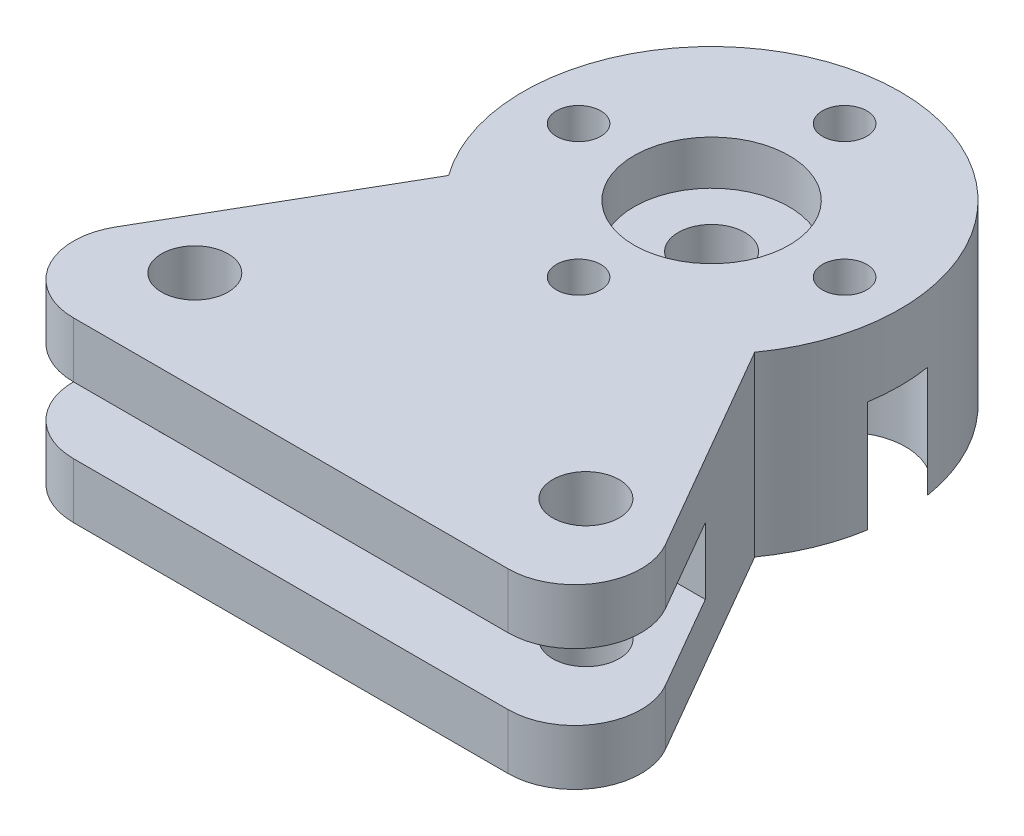
ISO-10303-21;
HEADER;
FILE_DESCRIPTION(('STEP AP214'),'2;1');
FILE_NAME('part.step','',(''),(''),'','','');
FILE_SCHEMA(('AUTOMOTIVE_DESIGN { 1 0 10303 214 1 1 1 1 }'));
ENDSEC;
DATA;
#1=APPLICATION_CONTEXT('core data for automotive mechanical design processes');
#2=APPLICATION_PROTOCOL_DEFINITION('international standard','automotive_design',2000,#1);
#3=PRODUCT_CONTEXT('',#1,'mechanical');
#4=PRODUCT('Part','Part','',(#3));
#5=PRODUCT_RELATED_PRODUCT_CATEGORY('part','',(#4));
#6=PRODUCT_DEFINITION_FORMATION('','',#4);
#7=PRODUCT_DEFINITION_CONTEXT('part definition',#1,'design');
#8=PRODUCT_DEFINITION('design','',#6,#7);
#9=PRODUCT_DEFINITION_SHAPE('','',#8);
#10=(LENGTH_UNIT() NAMED_UNIT(*) SI_UNIT(.MILLI.,.METRE.));
#11=(NAMED_UNIT(*) PLANE_ANGLE_UNIT() SI_UNIT($,.RADIAN.));
#12=(NAMED_UNIT(*) SI_UNIT($,.STERADIAN.) SOLID_ANGLE_UNIT());
#13=UNCERTAINTY_MEASURE_WITH_UNIT(LENGTH_MEASURE(1.E-05),#10,'distance_accuracy_value','');
#14=(GEOMETRIC_REPRESENTATION_CONTEXT(3) GLOBAL_UNCERTAINTY_ASSIGNED_CONTEXT((#13)) GLOBAL_UNIT_ASSIGNED_CONTEXT((#10,
#11,#12)) REPRESENTATION_CONTEXT('',''));
#15=CARTESIAN_POINT('',(0.,0.,0.));
#16=DIRECTION('',(0.,0.,1.));
#17=DIRECTION('',(1.,0.,0.));
#18=AXIS2_PLACEMENT_3D('',#15,#16,#17);
#19=CARTESIAN_POINT('',(0.,8.,-10.3205080756888));
#20=DIRECTION('',(0.,-1.,0.));
#21=DIRECTION('',(0.,0.,-1.));
#22=AXIS2_PLACEMENT_3D('',#19,#20,#21);
#23=CYLINDRICAL_SURFACE('',#22,1.49999999999987);
#24=CARTESIAN_POINT('',(0.,0.,-10.3205080756888));
#25=DIRECTION('',(0.,1.,0.));
#26=DIRECTION('',(0.,0.,1.));
#27=AXIS2_PLACEMENT_3D('',#24,#25,#26);
#28=CIRCLE('',#27,1.49999999999987);
#29=CARTESIAN_POINT('',(0.,0.,-8.82050807568898));
#30=VERTEX_POINT('',#29);
#31=EDGE_CURVE('E297',#30,#30,#28,.T.);
#32=ORIENTED_EDGE('',*,*,#31,.F.);
#33=EDGE_LOOP('',(#32));
#34=FACE_BOUND('',#33,.T.);
#35=CARTESIAN_POINT('',(0.,6.,-10.3205080756888));
#36=DIRECTION('',(0.,1.,0.));
#37=DIRECTION('',(0.,0.,1.));
#38=AXIS2_PLACEMENT_3D('',#35,#36,#37);
#39=CIRCLE('',#38,1.49999999999987);
#40=CARTESIAN_POINT('',(0.,6.,-8.82050807568898));
#41=VERTEX_POINT('',#40);
#42=EDGE_CURVE('E368',#41,#41,#39,.T.);
#43=ORIENTED_EDGE('',*,*,#42,.T.);
#44=EDGE_LOOP('',(#43));
#45=FACE_BOUND('',#44,.T.);
#46=ADVANCED_FACE('F67',(#34,#45),#23,.F.);
#47=CARTESIAN_POINT('',(5.99999999999984,32.0416305603426,-10.3205080756888));
#48=DIRECTION('',(0.,-1.,0.));
#49=DIRECTION('',(0.,0.,-1.));
#50=AXIS2_PLACEMENT_3D('',#47,#48,#49);
#51=CYLINDRICAL_SURFACE('',#50,1.);
#52=CARTESIAN_POINT('',(5.99999999999984,8.,-10.3205080756888));
#53=DIRECTION('',(0.,1.,0.));
#54=DIRECTION('',(0.,0.,1.));
#55=AXIS2_PLACEMENT_3D('',#52,#53,#54);
#56=CIRCLE('',#55,1.);
#57=CARTESIAN_POINT('',(5.99999999999984,8.,-9.32050807568884));
#58=VERTEX_POINT('',#57);
#59=EDGE_CURVE('E242',#58,#58,#56,.F.);
#60=ORIENTED_EDGE('',*,*,#59,.F.);
#61=EDGE_LOOP('',(#60));
#62=FACE_BOUND('',#61,.T.);
#63=CARTESIAN_POINT('',(5.99999999999984,5.,-10.3205080756888));
#64=DIRECTION('',(0.,-1.,0.));
#65=DIRECTION('',(0.,0.,-1.));
#66=AXIS2_PLACEMENT_3D('',#63,#64,#65);
#67=CIRCLE('',#66,1.);
#68=CARTESIAN_POINT('',(5.99999999999984,5.,-11.3205080756888));
#69=VERTEX_POINT('',#68);
#70=EDGE_CURVE('E236',#69,#69,#67,.F.);
#71=ORIENTED_EDGE('',*,*,#70,.F.);
#72=EDGE_LOOP('',(#71));
#73=FACE_BOUND('',#72,.T.);
#74=ADVANCED_FACE('F469',(#62,#73),#51,.F.);
#75=CARTESIAN_POINT('',(-1.59594559789866E-13,32.0416305603426,-16.3205080756888));
#76=DIRECTION('',(0.,-1.,0.));
#77=DIRECTION('',(0.,0.,-1.));
#78=AXIS2_PLACEMENT_3D('',#75,#76,#77);
#79=CYLINDRICAL_SURFACE('',#78,1.);
#80=CARTESIAN_POINT('',(-1.59594559789866E-13,8.,-16.3205080756888));
#81=DIRECTION('',(0.,1.,0.));
#82=DIRECTION('',(0.,0.,1.));
#83=AXIS2_PLACEMENT_3D('',#80,#81,#82);
#84=CIRCLE('',#83,1.);
#85=CARTESIAN_POINT('',(-1.59594559789866E-13,8.,-15.3205080756888));
#86=VERTEX_POINT('',#85);
#87=EDGE_CURVE('E216',#86,#86,#84,.F.);
#88=ORIENTED_EDGE('',*,*,#87,.F.);
#89=EDGE_LOOP('',(#88));
#90=FACE_BOUND('',#89,.T.);
#91=CARTESIAN_POINT('',(-1.59594559789866E-13,5.,-16.3205080756888));
#92=DIRECTION('',(0.,-1.,0.));
#93=DIRECTION('',(0.,0.,-1.));
#94=AXIS2_PLACEMENT_3D('',#91,#92,#93);
#95=CIRCLE('',#94,1.);
#96=CARTESIAN_POINT('',(-1.59594559789866E-13,5.,-17.3205080756888));
#97=VERTEX_POINT('',#96);
#98=EDGE_CURVE('E356',#97,#97,#95,.F.);
#99=ORIENTED_EDGE('',*,*,#98,.F.);
#100=EDGE_LOOP('',(#99));
#101=FACE_BOUND('',#100,.T.);
#102=ADVANCED_FACE('F475',(#90,#101),#79,.F.);
#103=CARTESIAN_POINT('',(-6.00000000000016,32.0416305603426,-10.3205080756888));
#104=DIRECTION('',(0.,-1.,0.));
#105=DIRECTION('',(0.,0.,-1.));
#106=AXIS2_PLACEMENT_3D('',#103,#104,#105);
#107=CYLINDRICAL_SURFACE('',#106,1.);
#108=CARTESIAN_POINT('',(-6.00000000000016,8.,-10.3205080756888));
#109=DIRECTION('',(0.,1.,0.));
#110=DIRECTION('',(0.,0.,1.));
#111=AXIS2_PLACEMENT_3D('',#108,#109,#110);
#112=CIRCLE('',#111,1.);
#113=CARTESIAN_POINT('',(-6.00000000000016,8.,-9.32050807568884));
#114=VERTEX_POINT('',#113);
#115=EDGE_CURVE('E221',#114,#114,#112,.F.);
#116=ORIENTED_EDGE('',*,*,#115,.F.);
#117=EDGE_LOOP('',(#116));
#118=FACE_BOUND('',#117,.T.);
#119=CARTESIAN_POINT('',(-6.00000000000016,5.,-10.3205080756888));
#120=DIRECTION('',(0.,-1.,0.));
#121=DIRECTION('',(0.,0.,-1.));
#122=AXIS2_PLACEMENT_3D('',#119,#120,#121);
#123=CIRCLE('',#122,1.);
#124=CARTESIAN_POINT('',(-6.00000000000016,5.,-11.3205080756888));
#125=VERTEX_POINT('',#124);
#126=EDGE_CURVE('E353',#125,#125,#123,.F.);
#127=ORIENTED_EDGE('',*,*,#126,.F.);
#128=EDGE_LOOP('',(#127));
#129=FACE_BOUND('',#128,.T.);
#130=ADVANCED_FACE('F502',(#118,#129),#107,.F.);
#131=CARTESIAN_POINT('',(9.80384757729342,8.,5.66025403784427));
#132=DIRECTION('',(0.,-1.,0.));
#133=DIRECTION('',(0.,0.,-1.));
#134=AXIS2_PLACEMENT_3D('',#131,#132,#133);
#135=CYLINDRICAL_SURFACE('',#134,3.);
#136=DIRECTION('',(0.,-1.,0.));
#137=VECTOR('',#136,1.);
#138=CARTESIAN_POINT('',(9.80384757729323,8.,8.66025403784454));
#139=LINE('',#138,#137);
#140=CARTESIAN_POINT('',(9.80384757729323,8.,8.66025403784454));
#141=VERTEX_POINT('',#140);
#142=CARTESIAN_POINT('',(9.80384757729323,5.5,8.66025403784439));
#143=VERTEX_POINT('',#142);
#144=EDGE_CURVE('E328',#141,#143,#139,.T.);
#145=ORIENTED_EDGE('',*,*,#144,.T.);
#146=CARTESIAN_POINT('',(9.80384757729342,5.5,5.66025403784427));
#147=DIRECTION('',(0.,1.,0.));
#148=DIRECTION('',(0.,0.,1.));
#149=AXIS2_PLACEMENT_3D('',#146,#147,#148);
#150=CIRCLE('',#149,3.);
#151=CARTESIAN_POINT('',(12.4019237886466,5.5,4.16025403784458));
#152=VERTEX_POINT('',#151);
#153=EDGE_CURVE('E281',#143,#152,#150,.T.);
#154=ORIENTED_EDGE('',*,*,#153,.T.);
#155=DIRECTION('',(0.,-1.,0.));
#156=VECTOR('',#155,1.);
#157=CARTESIAN_POINT('',(12.4019237886466,8.,4.16025403784458));
#158=LINE('',#157,#156);
#159=CARTESIAN_POINT('',(12.4019237886466,8.,4.16025403784458));
#160=VERTEX_POINT('',#159);
#161=EDGE_CURVE('E340',#160,#152,#158,.T.);
#162=ORIENTED_EDGE('',*,*,#161,.F.);
#163=CARTESIAN_POINT('',(9.80384757729342,8.,5.66025403784427));
#164=DIRECTION('',(0.,1.,0.));
#165=DIRECTION('',(0.,0.,1.));
#166=AXIS2_PLACEMENT_3D('',#163,#164,#165);
#167=CIRCLE('',#166,3.);
#168=EDGE_CURVE('E303',#141,#160,#167,.T.);
#169=ORIENTED_EDGE('',*,*,#168,.F.);
#170=EDGE_LOOP('',(#145,#154,#162,#169));
#171=FACE_BOUND('',#170,.T.);
#172=ADVANCED_FACE('F439',(#171),#135,.T.);
#173=CARTESIAN_POINT('',(-9.8038475772933,8.,5.66025403784441));
#174=DIRECTION('',(0.,-1.,0.));
#175=DIRECTION('',(0.,0.,-1.));
#176=AXIS2_PLACEMENT_3D('',#173,#174,#175);
#177=CYLINDRICAL_SURFACE('',#176,3.00000000000003);
#178=DIRECTION('',(0.,-1.,0.));
#179=VECTOR('',#178,1.);
#180=CARTESIAN_POINT('',(-12.4019237886466,8.,4.16025403784429));
#181=LINE('',#180,#179);
#182=CARTESIAN_POINT('',(-12.4019237886466,8.,4.16025403784429));
#183=VERTEX_POINT('',#182);
#184=CARTESIAN_POINT('',(-12.4019237886466,5.5,4.16025403784429));
#185=VERTEX_POINT('',#184);
#186=EDGE_CURVE('E336',#183,#185,#181,.T.);
#187=ORIENTED_EDGE('',*,*,#186,.T.);
#188=CARTESIAN_POINT('',(-9.8038475772933,5.5,5.66025403784441));
#189=DIRECTION('',(0.,1.,0.));
#190=DIRECTION('',(0.,0.,1.));
#191=AXIS2_PLACEMENT_3D('',#188,#189,#190);
#192=CIRCLE('',#191,3.00000000000003);
#193=CARTESIAN_POINT('',(-9.80384757729351,5.5,8.66025403784439));
#194=VERTEX_POINT('',#193);
#195=EDGE_CURVE('E272',#185,#194,#192,.T.);
#196=ORIENTED_EDGE('',*,*,#195,.T.);
#197=DIRECTION('',(0.,-1.,0.));
#198=VECTOR('',#197,1.);
#199=CARTESIAN_POINT('',(-9.80384757729351,8.,8.66025403784424));
#200=LINE('',#199,#198);
#201=CARTESIAN_POINT('',(-9.80384757729351,8.,8.66025403784424));
#202=VERTEX_POINT('',#201);
#203=EDGE_CURVE('E332',#202,#194,#200,.T.);
#204=ORIENTED_EDGE('',*,*,#203,.F.);
#205=CARTESIAN_POINT('',(-9.8038475772933,8.,5.66025403784441));
#206=DIRECTION('',(0.,1.,0.));
#207=DIRECTION('',(0.,0.,1.));
#208=AXIS2_PLACEMENT_3D('',#205,#206,#207);
#209=CIRCLE('',#208,3.00000000000003);
#210=EDGE_CURVE('E312',#183,#202,#209,.T.);
#211=ORIENTED_EDGE('',*,*,#210,.F.);
#212=EDGE_LOOP('',(#187,#196,#204,#211));
#213=FACE_BOUND('',#212,.T.);
#214=ADVANCED_FACE('F449',(#213),#177,.T.);
#215=CARTESIAN_POINT('',(-9.80384757729351,8.,8.66025403784424));
#216=DIRECTION('',(0.,0.,-1.));
#217=DIRECTION('',(-1.,0.,0.));
#218=AXIS2_PLACEMENT_3D('',#215,#216,#217);
#219=PLANE('',#218);
#220=ORIENTED_EDGE('',*,*,#203,.T.);
#221=DIRECTION('',(-1.,0.,0.));
#222=VECTOR('',#221,1.);
#223=CARTESIAN_POINT('',(-13.188871290062,5.5,8.66025403784439));
#224=LINE('',#223,#222);
#225=EDGE_CURVE('E241',#143,#194,#224,.T.);
#226=ORIENTED_EDGE('',*,*,#225,.F.);
#227=ORIENTED_EDGE('',*,*,#144,.F.);
#228=DIRECTION('',(1.,0.,0.));
#229=VECTOR('',#228,1.);
#230=CARTESIAN_POINT('',(-9.80384757729351,8.,8.66025403784424));
#231=LINE('',#230,#229);
#232=EDGE_CURVE('E314',#202,#141,#231,.T.);
#233=ORIENTED_EDGE('',*,*,#232,.F.);
#234=EDGE_LOOP('',(#220,#226,#227,#233));
#235=FACE_BOUND('',#234,.T.);
#236=ADVANCED_FACE('F446',(#235),#219,.F.);
#237=CARTESIAN_POINT('',(-8.82025404,8.,4.16949192431116));
#238=DIRECTION('',(0.,-1.,0.));
#239=DIRECTION('',(0.,0.,-1.));
#240=AXIS2_PLACEMENT_3D('',#237,#238,#239);
#241=CYLINDRICAL_SURFACE('',#240,1.5);
#242=CARTESIAN_POINT('',(-8.82025404,5.5,4.16949192431116));
#243=DIRECTION('',(0.,1.,0.));
#244=DIRECTION('',(0.,0.,1.));
#245=AXIS2_PLACEMENT_3D('',#242,#243,#244);
#246=CIRCLE('',#245,1.5);
#247=CARTESIAN_POINT('',(-8.82025404,5.5,5.66949192431116));
#248=VERTEX_POINT('',#247);
#249=EDGE_CURVE('E269',#248,#248,#246,.T.);
#250=ORIENTED_EDGE('',*,*,#249,.F.);
#251=EDGE_LOOP('',(#250));
#252=FACE_BOUND('',#251,.T.);
#253=CARTESIAN_POINT('',(-8.82025404,8.,4.16949192431116));
#254=DIRECTION('',(0.,1.,0.));
#255=DIRECTION('',(0.,0.,1.));
#256=AXIS2_PLACEMENT_3D('',#253,#254,#255);
#257=CIRCLE('',#256,1.5);
#258=CARTESIAN_POINT('',(-8.82025404,8.,5.66949192431116));
#259=VERTEX_POINT('',#258);
#260=EDGE_CURVE('E294',#259,#259,#257,.T.);
#261=ORIENTED_EDGE('',*,*,#260,.T.);
#262=EDGE_LOOP('',(#261));
#263=FACE_BOUND('',#262,.T.);
#264=ADVANCED_FACE('F526',(#252,#263),#241,.F.);
#265=CARTESIAN_POINT('',(8.82025404,8.,4.16949192431116));
#266=DIRECTION('',(0.,-1.,0.));
#267=DIRECTION('',(0.,0.,-1.));
#268=AXIS2_PLACEMENT_3D('',#265,#266,#267);
#269=CYLINDRICAL_SURFACE('',#268,1.5);
#270=CARTESIAN_POINT('',(8.82025404,5.5,4.16949192431116));
#271=DIRECTION('',(0.,1.,0.));
#272=DIRECTION('',(0.,0.,1.));
#273=AXIS2_PLACEMENT_3D('',#270,#271,#272);
#274=CIRCLE('',#273,1.5);
#275=CARTESIAN_POINT('',(8.82025404,5.5,5.66949192431116));
#276=VERTEX_POINT('',#275);
#277=EDGE_CURVE('E268',#276,#276,#274,.T.);
#278=ORIENTED_EDGE('',*,*,#277,.F.);
#279=EDGE_LOOP('',(#278));
#280=FACE_BOUND('',#279,.T.);
#281=CARTESIAN_POINT('',(8.82025404,8.,4.16949192431116));
#282=DIRECTION('',(0.,1.,0.));
#283=DIRECTION('',(0.,0.,-1.));
#284=AXIS2_PLACEMENT_3D('',#281,#282,#283);
#285=CIRCLE('',#284,1.5);
#286=CARTESIAN_POINT('',(8.82025404,8.,2.66949192431116));
#287=VERTEX_POINT('',#286);
#288=EDGE_CURVE('E288',#287,#287,#285,.T.);
#289=ORIENTED_EDGE('',*,*,#288,.T.);
#290=EDGE_LOOP('',(#289));
#291=FACE_BOUND('',#290,.T.);
#292=ADVANCED_FACE('F485',(#280,#291),#269,.F.);
#293=CARTESIAN_POINT('',(9.80384757729342,8.,5.66025403784427));
#294=DIRECTION('',(0.,1.,0.));
#295=DIRECTION('',(0.,0.,1.));
#296=AXIS2_PLACEMENT_3D('',#293,#294,#295);
#297=PLANE('',#296);
#298=CARTESIAN_POINT('',(0.,8.,-4.32050807568884));
#299=DIRECTION('',(0.,1.,0.));
#300=DIRECTION('',(0.,0.,1.));
#301=AXIS2_PLACEMENT_3D('',#298,#299,#300);
#302=CIRCLE('',#301,1.);
#303=CARTESIAN_POINT('',(0.,8.,-3.32050807568884));
#304=VERTEX_POINT('',#303);
#305=EDGE_CURVE('E383',#304,#304,#302,.T.);
#306=ORIENTED_EDGE('',*,*,#305,.F.);
#307=EDGE_LOOP('',(#306));
#308=FACE_BOUND('',#307,.T.);
#309=CARTESIAN_POINT('',(0.,8.,-10.3205080756888));
#310=DIRECTION('',(0.,1.,0.));
#311=DIRECTION('',(0.,0.,1.));
#312=AXIS2_PLACEMENT_3D('',#309,#310,#311);
#313=CIRCLE('',#312,3.5);
#314=CARTESIAN_POINT('',(0.,8.,-6.82050807568885));
#315=VERTEX_POINT('',#314);
#316=EDGE_CURVE('E378',#315,#315,#313,.T.);
#317=ORIENTED_EDGE('',*,*,#316,.F.);
#318=EDGE_LOOP('',(#317));
#319=FACE_BOUND('',#318,.T.);
#320=DIRECTION('',(-0.499999999999987,0.,-0.866025403784447));
#321=VECTOR('',#320,1.);
#322=CARTESIAN_POINT('',(12.4019237886466,8.,4.16025403784458));
#323=LINE('',#322,#321);
#324=CARTESIAN_POINT('',(6.90407225945287,8.,-5.36230414318958));
#325=VERTEX_POINT('',#324);
#326=EDGE_CURVE('E306',#160,#325,#323,.T.);
#327=ORIENTED_EDGE('',*,*,#326,.T.);
#328=CARTESIAN_POINT('',(-1.59594559789866E-13,8.,-10.3205080756888));
#329=DIRECTION('',(0.,1.,0.));
#330=DIRECTION('',(0.,0.,1.));
#331=AXIS2_PLACEMENT_3D('',#328,#329,#330);
#332=CIRCLE('',#331,8.5);
#333=CARTESIAN_POINT('',(-6.90407225945299,8.,-5.3623041431893));
#334=VERTEX_POINT('',#333);
#335=EDGE_CURVE('E226',#334,#325,#332,.F.);
#336=ORIENTED_EDGE('',*,*,#335,.F.);
#337=DIRECTION('',(-0.500000000000014,0.,0.866025403784431));
#338=VECTOR('',#337,1.);
#339=CARTESIAN_POINT('',(-2.59807621135311,8.,-12.8205080756888));
#340=LINE('',#339,#338);
#341=EDGE_CURVE('E310',#334,#183,#340,.T.);
#342=ORIENTED_EDGE('',*,*,#341,.T.);
#343=ORIENTED_EDGE('',*,*,#210,.T.);
#344=ORIENTED_EDGE('',*,*,#232,.T.);
#345=ORIENTED_EDGE('',*,*,#168,.T.);
#346=EDGE_LOOP('',(#327,#336,#342,#343,#344,#345));
#347=FACE_BOUND('',#346,.T.);
#348=ORIENTED_EDGE('',*,*,#260,.F.);
#349=EDGE_LOOP('',(#348));
#350=FACE_BOUND('',#349,.T.);
#351=ORIENTED_EDGE('',*,*,#288,.F.);
#352=EDGE_LOOP('',(#351));
#353=FACE_BOUND('',#352,.T.);
#354=ORIENTED_EDGE('',*,*,#59,.T.);
#355=EDGE_LOOP('',(#354));
#356=FACE_BOUND('',#355,.T.);
#357=ORIENTED_EDGE('',*,*,#115,.T.);
#358=EDGE_LOOP('',(#357));
#359=FACE_BOUND('',#358,.T.);
#360=ORIENTED_EDGE('',*,*,#87,.T.);
#361=EDGE_LOOP('',(#360));
#362=FACE_BOUND('',#361,.T.);
#363=ADVANCED_FACE('F433',(#308,#319,#347,#350,#353,#356,#359,#362),#297,.T.);
#364=CARTESIAN_POINT('',(9.80384757729342,0.,5.66025403784427));
#365=DIRECTION('',(0.,1.,0.));
#366=DIRECTION('',(0.,0.,1.));
#367=AXIS2_PLACEMENT_3D('',#364,#365,#366);
#368=PLANE('',#367);
#369=CARTESIAN_POINT('',(-1.63866938456849E-13,0.,-4.32050807568885));
#370=DIRECTION('',(0.,-1.,0.));
#371=DIRECTION('',(0.,0.,1.));
#372=AXIS2_PLACEMENT_3D('',#369,#370,#371);
#373=CIRCLE('',#372,2.75);
#374=CARTESIAN_POINT('',(-1.63866938456849E-13,0.,-1.57050807568885));
#375=VERTEX_POINT('',#374);
#376=EDGE_CURVE('E375',#375,#375,#373,.T.);
#377=ORIENTED_EDGE('',*,*,#376,.F.);
#378=EDGE_LOOP('',(#377));
#379=FACE_BOUND('',#378,.T.);
#380=CARTESIAN_POINT('',(-1.59594559789866E-13,0.,-10.3205080756888));
#381=DIRECTION('',(0.,-1.,0.));
#382=DIRECTION('',(0.,0.,-1.));
#383=AXIS2_PLACEMENT_3D('',#380,#381,#382);
#384=CIRCLE('',#383,8.5);
#385=CARTESIAN_POINT('',(-6.90407225945299,0.,-5.3623041431893));
#386=VERTEX_POINT('',#385);
#387=CARTESIAN_POINT('',(-8.39062500000016,0.,-8.96131268525559));
#388=VERTEX_POINT('',#387);
#389=EDGE_CURVE('E206',#386,#388,#384,.T.);
#390=ORIENTED_EDGE('',*,*,#389,.T.);
#391=CARTESIAN_POINT('',(-6.00000000000016,0.,-10.3205080756888));
#392=DIRECTION('',(0.,-1.,0.));
#393=DIRECTION('',(0.,0.,-1.));
#394=AXIS2_PLACEMENT_3D('',#391,#392,#393);
#395=CIRCLE('',#394,2.75);
#396=CARTESIAN_POINT('',(-8.39062500000016,0.,-11.6797034661221));
#397=VERTEX_POINT('',#396);
#398=EDGE_CURVE('E192',#397,#388,#395,.T.);
#399=ORIENTED_EDGE('',*,*,#398,.F.);
#400=CARTESIAN_POINT('',(-1.35919539043342,0.,-18.7111330756888));
#401=VERTEX_POINT('',#400);
#402=EDGE_CURVE('E217',#397,#401,#384,.T.);
#403=ORIENTED_EDGE('',*,*,#402,.T.);
#404=CARTESIAN_POINT('',(-1.59594559789866E-13,0.,-16.3205080756888));
#405=DIRECTION('',(0.,-1.,0.));
#406=DIRECTION('',(0.,0.,-1.));
#407=AXIS2_PLACEMENT_3D('',#404,#405,#406);
#408=CIRCLE('',#407,2.75);
#409=CARTESIAN_POINT('',(1.3591953904331,0.,-18.7111330756888));
#410=VERTEX_POINT('',#409);
#411=EDGE_CURVE('E390',#410,#401,#408,.T.);
#412=ORIENTED_EDGE('',*,*,#411,.F.);
#413=CARTESIAN_POINT('',(8.39062499999984,0.,-11.6797034661221));
#414=VERTEX_POINT('',#413);
#415=EDGE_CURVE('E223',#410,#414,#384,.T.);
#416=ORIENTED_EDGE('',*,*,#415,.T.);
#417=CARTESIAN_POINT('',(5.99999999999984,0.,-10.3205080756888));
#418=DIRECTION('',(0.,-1.,0.));
#419=DIRECTION('',(0.,0.,-1.));
#420=AXIS2_PLACEMENT_3D('',#417,#418,#419);
#421=CIRCLE('',#420,2.75);
#422=CARTESIAN_POINT('',(8.39062499999984,0.,-8.96131268525559));
#423=VERTEX_POINT('',#422);
#424=EDGE_CURVE('E201',#423,#414,#421,.T.);
#425=ORIENTED_EDGE('',*,*,#424,.F.);
#426=CARTESIAN_POINT('',(6.90407225945287,0.,-5.36230414318958));
#427=VERTEX_POINT('',#426);
#428=EDGE_CURVE('E219',#423,#427,#384,.T.);
#429=ORIENTED_EDGE('',*,*,#428,.T.);
#430=DIRECTION('',(-0.499999999999987,0.,-0.866025403784447));
#431=VECTOR('',#430,1.);
#432=CARTESIAN_POINT('',(12.4019237886466,0.,4.16025403784458));
#433=LINE('',#432,#431);
#434=CARTESIAN_POINT('',(12.4019237886466,0.,4.16025403784458));
#435=VERTEX_POINT('',#434);
#436=EDGE_CURVE('E319',#435,#427,#433,.T.);
#437=ORIENTED_EDGE('',*,*,#436,.F.);
#438=CARTESIAN_POINT('',(9.80384757729342,0.,5.66025403784427));
#439=DIRECTION('',(0.,1.,0.));
#440=DIRECTION('',(0.,0.,1.));
#441=AXIS2_PLACEMENT_3D('',#438,#439,#440);
#442=CIRCLE('',#441,3.);
#443=CARTESIAN_POINT('',(9.80384757729323,0.,8.66025403784454));
#444=VERTEX_POINT('',#443);
#445=EDGE_CURVE('E302',#444,#435,#442,.T.);
#446=ORIENTED_EDGE('',*,*,#445,.F.);
#447=DIRECTION('',(1.,0.,0.));
#448=VECTOR('',#447,1.);
#449=CARTESIAN_POINT('',(-9.80384757729351,0.,8.66025403784424));
#450=LINE('',#449,#448);
#451=CARTESIAN_POINT('',(-9.80384757729351,0.,8.66025403784424));
#452=VERTEX_POINT('',#451);
#453=EDGE_CURVE('E307',#452,#444,#450,.T.);
#454=ORIENTED_EDGE('',*,*,#453,.F.);
#455=CARTESIAN_POINT('',(-9.8038475772933,0.,5.66025403784441));
#456=DIRECTION('',(0.,1.,0.));
#457=DIRECTION('',(0.,0.,1.));
#458=AXIS2_PLACEMENT_3D('',#455,#456,#457);
#459=CIRCLE('',#458,3.00000000000003);
#460=CARTESIAN_POINT('',(-12.4019237886466,0.,4.16025403784429));
#461=VERTEX_POINT('',#460);
#462=EDGE_CURVE('E323',#461,#452,#459,.T.);
#463=ORIENTED_EDGE('',*,*,#462,.F.);
#464=DIRECTION('',(-0.500000000000014,0.,0.866025403784431));
#465=VECTOR('',#464,1.);
#466=CARTESIAN_POINT('',(-2.59807621135311,0.,-12.8205080756888));
#467=LINE('',#466,#465);
#468=EDGE_CURVE('E215',#386,#461,#467,.T.);
#469=ORIENTED_EDGE('',*,*,#468,.F.);
#470=EDGE_LOOP('',(#390,#399,#403,#412,#416,#425,#429,#437,#446,#454,#463,#469));
#471=FACE_BOUND('',#470,.T.);
#472=CARTESIAN_POINT('',(-8.82025404,0.,4.16949192431116));
#473=DIRECTION('',(0.,1.,0.));
#474=DIRECTION('',(0.,0.,1.));
#475=AXIS2_PLACEMENT_3D('',#472,#473,#474);
#476=CIRCLE('',#475,1.5);
#477=CARTESIAN_POINT('',(-8.82025404,0.,5.66949192431116));
#478=VERTEX_POINT('',#477);
#479=EDGE_CURVE('E291',#478,#478,#476,.T.);
#480=ORIENTED_EDGE('',*,*,#479,.T.);
#481=EDGE_LOOP('',(#480));
#482=FACE_BOUND('',#481,.T.);
#483=CARTESIAN_POINT('',(8.82025404,0.,4.16949192431116));
#484=DIRECTION('',(0.,1.,0.));
#485=DIRECTION('',(0.,0.,-1.));
#486=AXIS2_PLACEMENT_3D('',#483,#484,#485);
#487=CIRCLE('',#486,1.5);
#488=CARTESIAN_POINT('',(8.82025404,0.,2.66949192431116));
#489=VERTEX_POINT('',#488);
#490=EDGE_CURVE('E287',#489,#489,#487,.T.);
#491=ORIENTED_EDGE('',*,*,#490,.T.);
#492=EDGE_LOOP('',(#491));
#493=FACE_BOUND('',#492,.T.);
#494=ORIENTED_EDGE('',*,*,#31,.T.);
#495=EDGE_LOOP('',(#494));
#496=FACE_BOUND('',#495,.T.);
#497=ADVANCED_FACE('F212',(#379,#471,#482,#493,#496),#368,.F.);
#498=CARTESIAN_POINT('',(12.4019237886466,2.5,4.16025403784458));
#499=VERTEX_POINT('',#498);
#500=EDGE_CURVE('E339',#499,#435,#158,.T.);
#501=ORIENTED_EDGE('',*,*,#500,.F.);
#502=CARTESIAN_POINT('',(9.80384757729342,2.5,5.66025403784427));
#503=DIRECTION('',(0.,-1.,0.));
#504=DIRECTION('',(0.,0.,-1.));
#505=AXIS2_PLACEMENT_3D('',#502,#503,#504);
#506=CIRCLE('',#505,3.);
#507=CARTESIAN_POINT('',(9.80384757729323,2.5,8.66025403784439));
#508=VERTEX_POINT('',#507);
#509=EDGE_CURVE('E265',#499,#508,#506,.T.);
#510=ORIENTED_EDGE('',*,*,#509,.T.);
#511=EDGE_CURVE('E316',#508,#444,#139,.T.);
#512=ORIENTED_EDGE('',*,*,#511,.T.);
#513=ORIENTED_EDGE('',*,*,#445,.T.);
#514=EDGE_LOOP('',(#501,#510,#512,#513));
#515=FACE_BOUND('',#514,.T.);
#516=ADVANCED_FACE('F69',(#515),#135,.T.);
#517=CARTESIAN_POINT('',(12.4019237886466,8.,4.16025403784458));
#518=DIRECTION('',(-0.866025403784446,0.,0.499999999999986));
#519=DIRECTION('',(0.499999999999987,0.,0.866025403784447));
#520=AXIS2_PLACEMENT_3D('',#517,#518,#519);
#521=PLANE('',#520);
#522=ORIENTED_EDGE('',*,*,#436,.T.);
#523=DIRECTION('',(0.,-1.,0.));
#524=VECTOR('',#523,1.);
#525=CARTESIAN_POINT('',(6.90407225945287,32.0416305603426,-5.36230414318958));
#526=LINE('',#525,#524);
#527=EDGE_CURVE('E239',#427,#325,#526,.F.);
#528=ORIENTED_EDGE('',*,*,#527,.T.);
#529=ORIENTED_EDGE('',*,*,#326,.F.);
#530=ORIENTED_EDGE('',*,*,#161,.T.);
#531=DIRECTION('',(-0.499999999999987,0.,-0.866025403784447));
#532=VECTOR('',#531,1.);
#533=CARTESIAN_POINT('',(12.4019237886466,5.5,4.16025403784458));
#534=LINE('',#533,#532);
#535=CARTESIAN_POINT('',(9.94818514459069,5.5,-0.0897459621556108));
#536=VERTEX_POINT('',#535);
#537=EDGE_CURVE('E278',#152,#536,#534,.T.);
#538=ORIENTED_EDGE('',*,*,#537,.T.);
#539=DIRECTION('',(0.,-1.,0.));
#540=VECTOR('',#539,1.);
#541=CARTESIAN_POINT('',(9.94818514459069,8.,-0.0897459621556108));
#542=LINE('',#541,#540);
#543=CARTESIAN_POINT('',(9.94818514459069,2.5,-0.0897459621556108));
#544=VERTEX_POINT('',#543);
#545=EDGE_CURVE('E284',#536,#544,#542,.T.);
#546=ORIENTED_EDGE('',*,*,#545,.T.);
#547=DIRECTION('',(0.499999999999987,0.,0.866025403784447));
#548=VECTOR('',#547,1.);
#549=CARTESIAN_POINT('',(12.4019237886466,2.5,4.16025403784458));
#550=LINE('',#549,#548);
#551=EDGE_CURVE('E262',#544,#499,#550,.T.);
#552=ORIENTED_EDGE('',*,*,#551,.T.);
#553=ORIENTED_EDGE('',*,*,#500,.T.);
#554=EDGE_LOOP('',(#522,#528,#529,#530,#538,#546,#552,#553));
#555=FACE_BOUND('',#554,.T.);
#556=ADVANCED_FACE('F413',(#555),#521,.F.);
#557=CARTESIAN_POINT('',(-2.59807621135311,8.,-12.8205080756888));
#558=DIRECTION('',(0.866025403784431,0.,0.500000000000014));
#559=DIRECTION('',(0.500000000000014,0.,-0.866025403784431));
#560=AXIS2_PLACEMENT_3D('',#557,#558,#559);
#561=PLANE('',#560);
#562=ORIENTED_EDGE('',*,*,#341,.F.);
#563=DIRECTION('',(0.,-1.,0.));
#564=VECTOR('',#563,1.);
#565=CARTESIAN_POINT('',(-6.90407225945299,32.0416305603426,-5.3623041431893));
#566=LINE('',#565,#564);
#567=EDGE_CURVE('E350',#334,#386,#566,.T.);
#568=ORIENTED_EDGE('',*,*,#567,.T.);
#569=ORIENTED_EDGE('',*,*,#468,.T.);
#570=CARTESIAN_POINT('',(-12.4019237886466,2.5,4.16025403784429));
#571=VERTEX_POINT('',#570);
#572=EDGE_CURVE('E335',#571,#461,#181,.T.);
#573=ORIENTED_EDGE('',*,*,#572,.F.);
#574=DIRECTION('',(0.500000000000014,0.,-0.866025403784431));
#575=VECTOR('',#574,1.);
#576=CARTESIAN_POINT('',(-2.59807621135311,2.5,-12.8205080756888));
#577=LINE('',#576,#575);
#578=CARTESIAN_POINT('',(-9.94818514459086,2.5,-0.0897459621556108));
#579=VERTEX_POINT('',#578);
#580=EDGE_CURVE('E259',#571,#579,#577,.T.);
#581=ORIENTED_EDGE('',*,*,#580,.T.);
#582=DIRECTION('',(0.,1.,0.));
#583=VECTOR('',#582,1.);
#584=CARTESIAN_POINT('',(-9.94818514459086,8.,-0.0897459621556108));
#585=LINE('',#584,#583);
#586=CARTESIAN_POINT('',(-9.94818514459086,5.5,-0.0897459621556108));
#587=VERTEX_POINT('',#586);
#588=EDGE_CURVE('E343',#579,#587,#585,.T.);
#589=ORIENTED_EDGE('',*,*,#588,.T.);
#590=DIRECTION('',(-0.500000000000014,0.,0.866025403784431));
#591=VECTOR('',#590,1.);
#592=CARTESIAN_POINT('',(-2.59807621135311,5.5,-12.8205080756888));
#593=LINE('',#592,#591);
#594=EDGE_CURVE('E275',#587,#185,#593,.T.);
#595=ORIENTED_EDGE('',*,*,#594,.T.);
#596=ORIENTED_EDGE('',*,*,#186,.F.);
#597=EDGE_LOOP('',(#562,#568,#569,#573,#581,#589,#595,#596));
#598=FACE_BOUND('',#597,.T.);
#599=ADVANCED_FACE('F429',(#598),#561,.F.);
#600=CARTESIAN_POINT('',(-9.80384757729351,2.5,8.66025403784424));
#601=VERTEX_POINT('',#600);
#602=EDGE_CURVE('E331',#601,#452,#200,.T.);
#603=ORIENTED_EDGE('',*,*,#602,.F.);
#604=CARTESIAN_POINT('',(-9.8038475772933,2.5,5.66025403784441));
#605=DIRECTION('',(0.,-1.,0.));
#606=DIRECTION('',(0.,0.,-1.));
#607=AXIS2_PLACEMENT_3D('',#604,#605,#606);
#608=CIRCLE('',#607,3.00000000000003);
#609=EDGE_CURVE('E256',#601,#571,#608,.T.);
#610=ORIENTED_EDGE('',*,*,#609,.T.);
#611=ORIENTED_EDGE('',*,*,#572,.T.);
#612=ORIENTED_EDGE('',*,*,#462,.T.);
#613=EDGE_LOOP('',(#603,#610,#611,#612));
#614=FACE_BOUND('',#613,.T.);
#615=ADVANCED_FACE('F425',(#614),#177,.T.);
#616=ORIENTED_EDGE('',*,*,#511,.F.);
#617=DIRECTION('',(1.,0.,0.));
#618=VECTOR('',#617,1.);
#619=CARTESIAN_POINT('',(-13.188871290062,2.5,8.66025403784439));
#620=LINE('',#619,#618);
#621=EDGE_CURVE('E247',#601,#508,#620,.T.);
#622=ORIENTED_EDGE('',*,*,#621,.F.);
#623=ORIENTED_EDGE('',*,*,#602,.T.);
#624=ORIENTED_EDGE('',*,*,#453,.T.);
#625=EDGE_LOOP('',(#616,#622,#623,#624));
#626=FACE_BOUND('',#625,.T.);
#627=ADVANCED_FACE('F421',(#626),#219,.F.);
#628=CARTESIAN_POINT('',(-8.82025404,2.5,4.16949192431116));
#629=DIRECTION('',(0.,-1.,0.));
#630=DIRECTION('',(0.,0.,-1.));
#631=AXIS2_PLACEMENT_3D('',#628,#629,#630);
#632=CIRCLE('',#631,1.5);
#633=CARTESIAN_POINT('',(-8.82025404,2.5,2.66949192431116));
#634=VERTEX_POINT('',#633);
#635=EDGE_CURVE('E253',#634,#634,#632,.T.);
#636=ORIENTED_EDGE('',*,*,#635,.F.);
#637=EDGE_LOOP('',(#636));
#638=FACE_BOUND('',#637,.T.);
#639=ORIENTED_EDGE('',*,*,#479,.F.);
#640=EDGE_LOOP('',(#639));
#641=FACE_BOUND('',#640,.T.);
#642=ADVANCED_FACE('F481',(#638,#641),#241,.F.);
#643=CARTESIAN_POINT('',(8.82025404,2.5,4.16949192431116));
#644=DIRECTION('',(0.,-1.,0.));
#645=DIRECTION('',(0.,0.,-1.));
#646=AXIS2_PLACEMENT_3D('',#643,#644,#645);
#647=CIRCLE('',#646,1.5);
#648=CARTESIAN_POINT('',(8.82025404,2.5,2.66949192431116));
#649=VERTEX_POINT('',#648);
#650=EDGE_CURVE('E250',#649,#649,#647,.T.);
#651=ORIENTED_EDGE('',*,*,#650,.F.);
#652=EDGE_LOOP('',(#651));
#653=FACE_BOUND('',#652,.T.);
#654=ORIENTED_EDGE('',*,*,#490,.F.);
#655=EDGE_LOOP('',(#654));
#656=FACE_BOUND('',#655,.T.);
#657=ADVANCED_FACE('F517',(#653,#656),#269,.F.);
#658=CARTESIAN_POINT('',(0.,0.,-0.0897459621556108));
#659=DIRECTION('',(0.,0.,-1.));
#660=DIRECTION('',(-1.,0.,0.));
#661=AXIS2_PLACEMENT_3D('',#658,#659,#660);
#662=PLANE('',#661);
#663=DIRECTION('',(-1.,0.,0.));
#664=VECTOR('',#663,1.);
#665=CARTESIAN_POINT('',(-13.188871290062,5.5,-0.0897459621556108));
#666=LINE('',#665,#664);
#667=EDGE_CURVE('E243',#536,#587,#666,.T.);
#668=ORIENTED_EDGE('',*,*,#667,.T.);
#669=ORIENTED_EDGE('',*,*,#588,.F.);
#670=DIRECTION('',(1.,0.,0.));
#671=VECTOR('',#670,1.);
#672=CARTESIAN_POINT('',(-13.188871290062,2.5,-0.0897459621556108));
#673=LINE('',#672,#671);
#674=EDGE_CURVE('E246',#579,#544,#673,.T.);
#675=ORIENTED_EDGE('',*,*,#674,.T.);
#676=ORIENTED_EDGE('',*,*,#545,.F.);
#677=EDGE_LOOP('',(#668,#669,#675,#676));
#678=FACE_BOUND('',#677,.T.);
#679=ADVANCED_FACE('F452',(#678),#662,.F.);
#680=CARTESIAN_POINT('',(-13.188871290062,5.5,-0.0897459621556108));
#681=DIRECTION('',(0.,1.,0.));
#682=DIRECTION('',(0.,0.,1.));
#683=AXIS2_PLACEMENT_3D('',#680,#681,#682);
#684=PLANE('',#683);
#685=ORIENTED_EDGE('',*,*,#249,.T.);
#686=EDGE_LOOP('',(#685));
#687=FACE_BOUND('',#686,.T.);
#688=ORIENTED_EDGE('',*,*,#277,.T.);
#689=EDGE_LOOP('',(#688));
#690=FACE_BOUND('',#689,.T.);
#691=ORIENTED_EDGE('',*,*,#225,.T.);
#692=ORIENTED_EDGE('',*,*,#195,.F.);
#693=ORIENTED_EDGE('',*,*,#594,.F.);
#694=ORIENTED_EDGE('',*,*,#667,.F.);
#695=ORIENTED_EDGE('',*,*,#537,.F.);
#696=ORIENTED_EDGE('',*,*,#153,.F.);
#697=EDGE_LOOP('',(#691,#692,#693,#694,#695,#696));
#698=FACE_BOUND('',#697,.T.);
#699=ADVANCED_FACE('F443',(#687,#690,#698),#684,.F.);
#700=CARTESIAN_POINT('',(-13.188871290062,2.5,-0.0897459621556108));
#701=DIRECTION('',(0.,-1.,0.));
#702=DIRECTION('',(0.,0.,-1.));
#703=AXIS2_PLACEMENT_3D('',#700,#701,#702);
#704=PLANE('',#703);
#705=ORIENTED_EDGE('',*,*,#635,.T.);
#706=EDGE_LOOP('',(#705));
#707=FACE_BOUND('',#706,.T.);
#708=ORIENTED_EDGE('',*,*,#650,.T.);
#709=EDGE_LOOP('',(#708));
#710=FACE_BOUND('',#709,.T.);
#711=ORIENTED_EDGE('',*,*,#551,.F.);
#712=ORIENTED_EDGE('',*,*,#674,.F.);
#713=ORIENTED_EDGE('',*,*,#580,.F.);
#714=ORIENTED_EDGE('',*,*,#609,.F.);
#715=ORIENTED_EDGE('',*,*,#621,.T.);
#716=ORIENTED_EDGE('',*,*,#509,.F.);
#717=EDGE_LOOP('',(#711,#712,#713,#714,#715,#716));
#718=FACE_BOUND('',#717,.T.);
#719=ADVANCED_FACE('F454',(#707,#710,#718),#704,.F.);
#720=CARTESIAN_POINT('',(-1.59594559789866E-13,32.0416305603426,-10.3205080756888));
#721=DIRECTION('',(0.,-1.,0.));
#722=DIRECTION('',(0.,0.,-1.));
#723=AXIS2_PLACEMENT_3D('',#720,#721,#722);
#724=CYLINDRICAL_SURFACE('',#723,8.5);
#725=DIRECTION('',(0.,-1.,0.));
#726=VECTOR('',#725,1.);
#727=CARTESIAN_POINT('',(-8.39062500000016,2.5,-11.6797034661221));
#728=LINE('',#727,#726);
#729=CARTESIAN_POINT('',(-8.39062500000016,5.,-11.6797034661221));
#730=VERTEX_POINT('',#729);
#731=EDGE_CURVE('E12',#730,#397,#728,.T.);
#732=ORIENTED_EDGE('',*,*,#731,.F.);
#733=CARTESIAN_POINT('',(-1.59594559789866E-13,5.,-10.3205080756888));
#734=DIRECTION('',(0.,-1.,0.));
#735=DIRECTION('',(0.,0.,-1.));
#736=AXIS2_PLACEMENT_3D('',#733,#734,#735);
#737=CIRCLE('',#736,8.5);
#738=CARTESIAN_POINT('',(-8.39062500000016,5.,-8.96131268525559));
#739=VERTEX_POINT('',#738);
#740=EDGE_CURVE('E208',#730,#739,#737,.F.);
#741=ORIENTED_EDGE('',*,*,#740,.T.);
#742=DIRECTION('',(0.,-1.,0.));
#743=VECTOR('',#742,1.);
#744=CARTESIAN_POINT('',(-8.39062500000016,2.5,-8.96131268525558));
#745=LINE('',#744,#743);
#746=EDGE_CURVE('E76',#388,#739,#745,.F.);
#747=ORIENTED_EDGE('',*,*,#746,.F.);
#748=ORIENTED_EDGE('',*,*,#389,.F.);
#749=ORIENTED_EDGE('',*,*,#567,.F.);
#750=ORIENTED_EDGE('',*,*,#335,.T.);
#751=ORIENTED_EDGE('',*,*,#527,.F.);
#752=ORIENTED_EDGE('',*,*,#428,.F.);
#753=DIRECTION('',(0.,-1.,0.));
#754=VECTOR('',#753,1.);
#755=CARTESIAN_POINT('',(8.39062499999985,2.5,-8.9613126852556));
#756=LINE('',#755,#754);
#757=CARTESIAN_POINT('',(8.39062499999984,5.,-8.96131268525559));
#758=VERTEX_POINT('',#757);
#759=EDGE_CURVE('E209',#758,#423,#756,.T.);
#760=ORIENTED_EDGE('',*,*,#759,.F.);
#761=CARTESIAN_POINT('',(-1.59594559789866E-13,5.,-10.3205080756888));
#762=DIRECTION('',(0.,-1.,0.));
#763=DIRECTION('',(0.,0.,-1.));
#764=AXIS2_PLACEMENT_3D('',#761,#762,#763);
#765=CIRCLE('',#764,8.5);
#766=CARTESIAN_POINT('',(8.39062499999984,5.,-11.6797034661221));
#767=VERTEX_POINT('',#766);
#768=EDGE_CURVE('E232',#758,#767,#765,.F.);
#769=ORIENTED_EDGE('',*,*,#768,.T.);
#770=DIRECTION('',(0.,-1.,0.));
#771=VECTOR('',#770,1.);
#772=CARTESIAN_POINT('',(8.39062499999985,2.5,-11.6797034661221));
#773=LINE('',#772,#771);
#774=EDGE_CURVE('E366',#414,#767,#773,.F.);
#775=ORIENTED_EDGE('',*,*,#774,.F.);
#776=ORIENTED_EDGE('',*,*,#415,.F.);
#777=DIRECTION('',(0.,-1.,0.));
#778=VECTOR('',#777,1.);
#779=CARTESIAN_POINT('',(1.3591953904331,2.5,-18.7111330756888));
#780=LINE('',#779,#778);
#781=CARTESIAN_POINT('',(1.3591953904331,5.,-18.7111330756888));
#782=VERTEX_POINT('',#781);
#783=EDGE_CURVE('E364',#782,#410,#780,.T.);
#784=ORIENTED_EDGE('',*,*,#783,.F.);
#785=CARTESIAN_POINT('',(-1.59594559789866E-13,5.,-10.3205080756888));
#786=DIRECTION('',(0.,-1.,0.));
#787=DIRECTION('',(0.,0.,-1.));
#788=AXIS2_PLACEMENT_3D('',#785,#786,#787);
#789=CIRCLE('',#788,8.5);
#790=CARTESIAN_POINT('',(-1.35919539043342,5.,-18.7111330756888));
#791=VERTEX_POINT('',#790);
#792=EDGE_CURVE('E359',#782,#791,#789,.F.);
#793=ORIENTED_EDGE('',*,*,#792,.T.);
#794=DIRECTION('',(0.,-1.,0.));
#795=VECTOR('',#794,1.);
#796=CARTESIAN_POINT('',(-1.35919539043342,2.5,-18.7111330756888));
#797=LINE('',#796,#795);
#798=EDGE_CURVE('E352',#401,#791,#797,.F.);
#799=ORIENTED_EDGE('',*,*,#798,.F.);
#800=ORIENTED_EDGE('',*,*,#402,.F.);
#801=EDGE_LOOP('',(#732,#741,#747,#748,#749,#750,#751,#752,#760,#769,#775,#776,#784,#793,#799,#800));
#802=FACE_BOUND('',#801,.T.);
#803=ADVANCED_FACE('F204',(#802),#724,.T.);
#804=CARTESIAN_POINT('',(-6.00000000000016,5.,-10.3205080756888));
#805=DIRECTION('',(0.,-1.,0.));
#806=DIRECTION('',(0.,0.,-1.));
#807=AXIS2_PLACEMENT_3D('',#804,#805,#806);
#808=PLANE('',#807);
#809=CARTESIAN_POINT('',(-6.00000000000016,5.,-10.3205080756888));
#810=DIRECTION('',(0.,-1.,0.));
#811=DIRECTION('',(0.,0.,-1.));
#812=AXIS2_PLACEMENT_3D('',#809,#810,#811);
#813=CIRCLE('',#812,2.75);
#814=EDGE_CURVE('E83',#730,#739,#813,.T.);
#815=ORIENTED_EDGE('',*,*,#814,.T.);
#816=ORIENTED_EDGE('',*,*,#740,.F.);
#817=EDGE_LOOP('',(#815,#816));
#818=FACE_BOUND('',#817,.T.);
#819=ORIENTED_EDGE('',*,*,#126,.T.);
#820=EDGE_LOOP('',(#819));
#821=FACE_BOUND('',#820,.T.);
#822=ADVANCED_FACE('F462',(#818,#821),#808,.T.);
#823=CARTESIAN_POINT('',(-6.00000000000016,5.,-10.3205080756888));
#824=DIRECTION('',(0.,-1.,0.));
#825=DIRECTION('',(0.,0.,-1.));
#826=AXIS2_PLACEMENT_3D('',#823,#824,#825);
#827=CYLINDRICAL_SURFACE('',#826,2.75);
#828=ORIENTED_EDGE('',*,*,#731,.T.);
#829=ORIENTED_EDGE('',*,*,#398,.T.);
#830=ORIENTED_EDGE('',*,*,#746,.T.);
#831=ORIENTED_EDGE('',*,*,#814,.F.);
#832=EDGE_LOOP('',(#828,#829,#830,#831));
#833=FACE_BOUND('',#832,.T.);
#834=ADVANCED_FACE('F194',(#833),#827,.F.);
#835=CARTESIAN_POINT('',(-1.59594559789866E-13,5.,-16.3205080756888));
#836=DIRECTION('',(0.,-1.,0.));
#837=DIRECTION('',(0.,0.,-1.));
#838=AXIS2_PLACEMENT_3D('',#835,#836,#837);
#839=PLANE('',#838);
#840=CARTESIAN_POINT('',(-1.59594559789866E-13,5.,-16.3205080756888));
#841=DIRECTION('',(0.,-1.,0.));
#842=DIRECTION('',(0.,0.,-1.));
#843=AXIS2_PLACEMENT_3D('',#840,#841,#842);
#844=CIRCLE('',#843,2.75);
#845=EDGE_CURVE('E392',#782,#791,#844,.T.);
#846=ORIENTED_EDGE('',*,*,#845,.T.);
#847=ORIENTED_EDGE('',*,*,#792,.F.);
#848=EDGE_LOOP('',(#846,#847));
#849=FACE_BOUND('',#848,.T.);
#850=ORIENTED_EDGE('',*,*,#98,.T.);
#851=EDGE_LOOP('',(#850));
#852=FACE_BOUND('',#851,.T.);
#853=ADVANCED_FACE('F403',(#849,#852),#839,.T.);
#854=CARTESIAN_POINT('',(-1.59594559789866E-13,5.,-16.3205080756888));
#855=DIRECTION('',(0.,-1.,0.));
#856=DIRECTION('',(0.,0.,-1.));
#857=AXIS2_PLACEMENT_3D('',#854,#855,#856);
#858=CYLINDRICAL_SURFACE('',#857,2.75);
#859=ORIENTED_EDGE('',*,*,#783,.T.);
#860=ORIENTED_EDGE('',*,*,#411,.T.);
#861=ORIENTED_EDGE('',*,*,#798,.T.);
#862=ORIENTED_EDGE('',*,*,#845,.F.);
#863=EDGE_LOOP('',(#859,#860,#861,#862));
#864=FACE_BOUND('',#863,.T.);
#865=ADVANCED_FACE('F406',(#864),#858,.F.);
#866=CARTESIAN_POINT('',(5.99999999999984,5.,-10.3205080756888));
#867=DIRECTION('',(0.,-1.,0.));
#868=DIRECTION('',(0.,0.,-1.));
#869=AXIS2_PLACEMENT_3D('',#866,#867,#868);
#870=PLANE('',#869);
#871=CARTESIAN_POINT('',(5.99999999999984,5.,-10.3205080756888));
#872=DIRECTION('',(0.,-1.,0.));
#873=DIRECTION('',(0.,0.,-1.));
#874=AXIS2_PLACEMENT_3D('',#871,#872,#873);
#875=CIRCLE('',#874,2.75);
#876=EDGE_CURVE('E90',#758,#767,#875,.T.);
#877=ORIENTED_EDGE('',*,*,#876,.T.);
#878=ORIENTED_EDGE('',*,*,#768,.F.);
#879=EDGE_LOOP('',(#877,#878));
#880=FACE_BOUND('',#879,.T.);
#881=ORIENTED_EDGE('',*,*,#70,.T.);
#882=EDGE_LOOP('',(#881));
#883=FACE_BOUND('',#882,.T.);
#884=ADVANCED_FACE('F554',(#880,#883),#870,.T.);
#885=CARTESIAN_POINT('',(5.99999999999984,5.,-10.3205080756888));
#886=DIRECTION('',(0.,-1.,0.));
#887=DIRECTION('',(0.,0.,-1.));
#888=AXIS2_PLACEMENT_3D('',#885,#886,#887);
#889=CYLINDRICAL_SURFACE('',#888,2.75);
#890=ORIENTED_EDGE('',*,*,#759,.T.);
#891=ORIENTED_EDGE('',*,*,#424,.T.);
#892=ORIENTED_EDGE('',*,*,#774,.T.);
#893=ORIENTED_EDGE('',*,*,#876,.F.);
#894=EDGE_LOOP('',(#890,#891,#892,#893));
#895=FACE_BOUND('',#894,.T.);
#896=ADVANCED_FACE('F411',(#895),#889,.F.);
#897=CARTESIAN_POINT('',(-1.63866938456849E-13,5.,-4.32050807568885));
#898=DIRECTION('',(0.,-1.,0.));
#899=DIRECTION('',(0.,0.,-1.));
#900=AXIS2_PLACEMENT_3D('',#897,#898,#899);
#901=CYLINDRICAL_SURFACE('',#900,2.75);
#902=CARTESIAN_POINT('',(-1.63866938456849E-13,5.,-4.32050807568885));
#903=DIRECTION('',(0.,-1.,0.));
#904=DIRECTION('',(0.,0.,1.));
#905=AXIS2_PLACEMENT_3D('',#902,#903,#904);
#906=CIRCLE('',#905,2.75);
#907=CARTESIAN_POINT('',(-1.63866938456849E-13,5.,-1.57050807568885));
#908=VERTEX_POINT('',#907);
#909=EDGE_CURVE('E370',#908,#908,#906,.T.);
#910=ORIENTED_EDGE('',*,*,#909,.F.);
#911=EDGE_LOOP('',(#910));
#912=FACE_BOUND('',#911,.T.);
#913=ORIENTED_EDGE('',*,*,#376,.T.);
#914=EDGE_LOOP('',(#913));
#915=FACE_BOUND('',#914,.T.);
#916=ADVANCED_FACE('F559',(#912,#915),#901,.F.);
#917=CARTESIAN_POINT('',(-1.63866938456849E-13,5.,-4.32050807568885));
#918=DIRECTION('',(0.,1.,0.));
#919=DIRECTION('',(0.,0.,1.));
#920=AXIS2_PLACEMENT_3D('',#917,#918,#919);
#921=PLANE('',#920);
#922=CARTESIAN_POINT('',(0.,5.,-4.32050807568884));
#923=DIRECTION('',(0.,1.,0.));
#924=DIRECTION('',(0.,0.,1.));
#925=AXIS2_PLACEMENT_3D('',#922,#923,#924);
#926=CIRCLE('',#925,1.);
#927=CARTESIAN_POINT('',(0.,5.,-3.32050807568884));
#928=VERTEX_POINT('',#927);
#929=EDGE_CURVE('E71',#928,#928,#926,.T.);
#930=ORIENTED_EDGE('',*,*,#929,.T.);
#931=EDGE_LOOP('',(#930));
#932=FACE_BOUND('',#931,.T.);
#933=ORIENTED_EDGE('',*,*,#909,.T.);
#934=EDGE_LOOP('',(#933));
#935=FACE_BOUND('',#934,.T.);
#936=ADVANCED_FACE('F562',(#932,#935),#921,.F.);
#937=CARTESIAN_POINT('',(0.,6.,-10.3205080756888));
#938=DIRECTION('',(0.,1.,0.));
#939=DIRECTION('',(0.,0.,1.));
#940=AXIS2_PLACEMENT_3D('',#937,#938,#939);
#941=CYLINDRICAL_SURFACE('',#940,3.5);
#942=CARTESIAN_POINT('',(0.,6.,-10.3205080756888));
#943=DIRECTION('',(0.,1.,0.));
#944=DIRECTION('',(0.,0.,1.));
#945=AXIS2_PLACEMENT_3D('',#942,#943,#944);
#946=CIRCLE('',#945,3.5);
#947=CARTESIAN_POINT('',(0.,6.,-6.82050807568885));
#948=VERTEX_POINT('',#947);
#949=EDGE_CURVE('E371',#948,#948,#946,.T.);
#950=ORIENTED_EDGE('',*,*,#949,.F.);
#951=EDGE_LOOP('',(#950));
#952=FACE_BOUND('',#951,.T.);
#953=ORIENTED_EDGE('',*,*,#316,.T.);
#954=EDGE_LOOP('',(#953));
#955=FACE_BOUND('',#954,.T.);
#956=ADVANCED_FACE('F565',(#952,#955),#941,.F.);
#957=CARTESIAN_POINT('',(0.,6.,-10.3205080756888));
#958=DIRECTION('',(0.,1.,0.));
#959=DIRECTION('',(0.,0.,1.));
#960=AXIS2_PLACEMENT_3D('',#957,#958,#959);
#961=PLANE('',#960);
#962=ORIENTED_EDGE('',*,*,#42,.F.);
#963=EDGE_LOOP('',(#962));
#964=FACE_BOUND('',#963,.T.);
#965=ORIENTED_EDGE('',*,*,#949,.T.);
#966=EDGE_LOOP('',(#965));
#967=FACE_BOUND('',#966,.T.);
#968=ADVANCED_FACE('F570',(#964,#967),#961,.T.);
#969=CARTESIAN_POINT('',(0.,32.,-4.32050807568884));
#970=DIRECTION('',(0.,-1.,0.));
#971=DIRECTION('',(0.,0.,-1.));
#972=AXIS2_PLACEMENT_3D('',#969,#970,#971);
#973=CYLINDRICAL_SURFACE('',#972,1.);
#974=ORIENTED_EDGE('',*,*,#305,.T.);
#975=EDGE_LOOP('',(#974));
#976=FACE_BOUND('',#975,.T.);
#977=ORIENTED_EDGE('',*,*,#929,.F.);
#978=EDGE_LOOP('',(#977));
#979=FACE_BOUND('',#978,.T.);
#980=ADVANCED_FACE('F583',(#976,#979),#973,.F.);
#981=CLOSED_SHELL('',(#46,#74,#102,#130,#172,#214,#236,#264,#292,#363,#497,#516,#556,#599,#615,
#627,#642,#657,#679,#699,#719,#803,#822,#834,#853,#865,#884,#896,#916,#936,#956,#968,#980));
#982=MANIFOLD_SOLID_BREP('B2',#981);
#983=ADVANCED_BREP_SHAPE_REPRESENTATION('',(#18,#982),#14);
#984=SHAPE_DEFINITION_REPRESENTATION(#9,#983);
ENDSEC;
END-ISO-10303-21;
